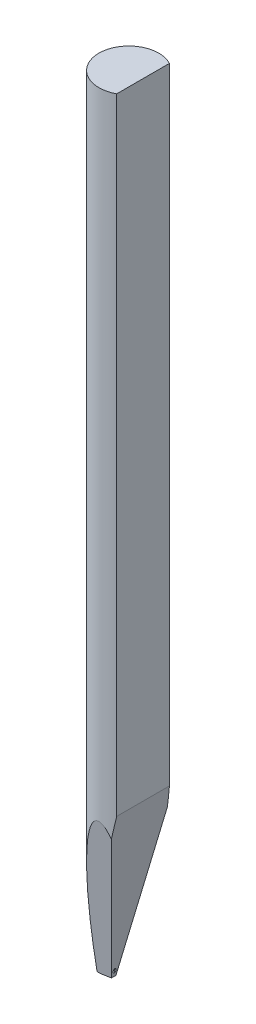
ISO-10303-21;
HEADER;
FILE_DESCRIPTION(('STEP AP214'),'2;1');
FILE_NAME('part.step','',(''),(''),'','','');
FILE_SCHEMA(('AUTOMOTIVE_DESIGN { 1 0 10303 214 1 1 1 1 }'));
ENDSEC;
DATA;
#1=APPLICATION_CONTEXT('core data for automotive mechanical design processes');
#2=APPLICATION_PROTOCOL_DEFINITION('international standard','automotive_design',2000,#1);
#3=PRODUCT_CONTEXT('',#1,'mechanical');
#4=PRODUCT('Part','Part','',(#3));
#5=PRODUCT_RELATED_PRODUCT_CATEGORY('part','',(#4));
#6=PRODUCT_DEFINITION_FORMATION('','',#4);
#7=PRODUCT_DEFINITION_CONTEXT('part definition',#1,'design');
#8=PRODUCT_DEFINITION('design','',#6,#7);
#9=PRODUCT_DEFINITION_SHAPE('','',#8);
#10=(LENGTH_UNIT() NAMED_UNIT(*) SI_UNIT(.MILLI.,.METRE.));
#11=(NAMED_UNIT(*) PLANE_ANGLE_UNIT() SI_UNIT($,.RADIAN.));
#12=(NAMED_UNIT(*) SI_UNIT($,.STERADIAN.) SOLID_ANGLE_UNIT());
#13=UNCERTAINTY_MEASURE_WITH_UNIT(LENGTH_MEASURE(1.E-05),#10,'distance_accuracy_value','');
#14=(GEOMETRIC_REPRESENTATION_CONTEXT(3) GLOBAL_UNCERTAINTY_ASSIGNED_CONTEXT((#13)) GLOBAL_UNIT_ASSIGNED_CONTEXT((#10,
#11,#12)) REPRESENTATION_CONTEXT('',''));
#15=CARTESIAN_POINT('',(0.,0.,0.));
#16=DIRECTION('',(0.,0.,1.));
#17=DIRECTION('',(1.,0.,0.));
#18=AXIS2_PLACEMENT_3D('',#15,#16,#17);
#19=CARTESIAN_POINT('',(0.,21.0312,0.));
#20=DIRECTION('',(0.,-1.,0.));
#21=DIRECTION('',(0.,0.,-1.));
#22=AXIS2_PLACEMENT_3D('',#19,#20,#21);
#23=CYLINDRICAL_SURFACE('',#22,0.792479999999998);
#24=CARTESIAN_POINT('',(0.,0.02413,0.));
#25=DIRECTION('',(0.,-1.,0.));
#26=DIRECTION('',(0.,0.,-1.));
#27=AXIS2_PLACEMENT_3D('',#24,#25,#26);
#28=CIRCLE('',#27,0.79248);
#29=CARTESIAN_POINT('',(-0.790565318424321,0.02413,0.0550547700444953));
#30=VERTEX_POINT('',#29);
#31=CARTESIAN_POINT('',(-0.792479866152421,0.02413,-0.000460589882886893));
#32=VERTEX_POINT('',#31);
#33=EDGE_CURVE('E161',#30,#32,#28,.T.);
#34=ORIENTED_EDGE('',*,*,#33,.F.);
#35=CARTESIAN_POINT('',(0.,-0.288101116436578,0.));
#36=DIRECTION('',(0.,-0.173648177666931,0.984807753012208));
#37=DIRECTION('',(0.,-0.984807753012208,-0.173648177666931));
#38=AXIS2_PLACEMENT_3D('',#35,#36,#37);
#39=ELLIPSE('',#38,4.56371043248163,0.792479999999998);
#40=CARTESIAN_POINT('',(0.279336812010102,3.91781682663915,0.741616812010104));
#41=VERTEX_POINT('',#40);
#42=EDGE_CURVE('E173',#41,#30,#39,.T.);
#43=ORIENTED_EDGE('',*,*,#42,.F.);
#44=CARTESIAN_POINT('',(0.,2.33361904313629,0.));
#45=DIRECTION('',(-0.984807753012208,0.173648177666931,0.));
#46=DIRECTION('',(-0.173648177666931,-0.984807753012208,0.));
#47=AXIS2_PLACEMENT_3D('',#44,#45,#46);
#48=ELLIPSE('',#47,4.56371043248164,0.792479999999998);
#49=CARTESIAN_POINT('',(0.37592,4.46556730476697,0.69764511322018));
#50=VERTEX_POINT('',#49);
#51=EDGE_CURVE('E308',#41,#50,#48,.T.);
#52=ORIENTED_EDGE('',*,*,#51,.T.);
#53=DIRECTION('',(0.,-1.,0.));
#54=VECTOR('',#53,1.);
#55=CARTESIAN_POINT('',(0.37592,21.0312,0.69764511322018));
#56=LINE('',#55,#54);
#57=CARTESIAN_POINT('',(0.37592,21.0312,0.69764511322018));
#58=VERTEX_POINT('',#57);
#59=EDGE_CURVE('E319',#58,#50,#56,.T.);
#60=ORIENTED_EDGE('',*,*,#59,.F.);
#61=CARTESIAN_POINT('',(0.,21.0312,0.));
#62=DIRECTION('',(0.,1.,0.));
#63=DIRECTION('',(0.,0.,1.));
#64=AXIS2_PLACEMENT_3D('',#61,#62,#63);
#65=CIRCLE('',#64,0.792479999999998);
#66=CARTESIAN_POINT('',(0.37592,21.0312,-0.69764511322018));
#67=VERTEX_POINT('',#66);
#68=EDGE_CURVE('E314',#67,#58,#65,.T.);
#69=ORIENTED_EDGE('',*,*,#68,.F.);
#70=DIRECTION('',(0.,-1.,0.));
#71=VECTOR('',#70,1.);
#72=CARTESIAN_POINT('',(0.37592,21.0312,-0.69764511322018));
#73=LINE('',#72,#71);
#74=CARTESIAN_POINT('',(0.37592,4.46556730476697,-0.69764511322018));
#75=VERTEX_POINT('',#74);
#76=EDGE_CURVE('E302',#75,#67,#73,.F.);
#77=ORIENTED_EDGE('',*,*,#76,.F.);
#78=CARTESIAN_POINT('',(0.279336812010102,3.91781682663915,-0.741616812010104));
#79=VERTEX_POINT('',#78);
#80=EDGE_CURVE('E299',#75,#79,#48,.T.);
#81=ORIENTED_EDGE('',*,*,#80,.T.);
#82=CARTESIAN_POINT('',(0.,-0.288101116436578,0.));
#83=DIRECTION('',(0.,-0.173648177666931,-0.984807753012208));
#84=DIRECTION('',(0.,-0.984807753012208,0.173648177666931));
#85=AXIS2_PLACEMENT_3D('',#82,#83,#84);
#86=ELLIPSE('',#85,4.56371043248163,0.792479999999998);
#87=CARTESIAN_POINT('',(-0.790565318424321,0.02413,-0.0550547700444953));
#88=VERTEX_POINT('',#87);
#89=EDGE_CURVE('E54',#88,#79,#86,.T.);
#90=ORIENTED_EDGE('',*,*,#89,.F.);
#91=EDGE_CURVE('E176',#32,#88,#28,.T.);
#92=ORIENTED_EDGE('',*,*,#91,.F.);
#93=EDGE_LOOP('',(#34,#43,#52,#60,#69,#77,#81,#90,#92));
#94=FACE_BOUND('',#93,.T.);
#95=ADVANCED_FACE('F46',(#94),#23,.T.);
#96=CARTESIAN_POINT('',(26.8738719491216,0.,0.0508));
#97=DIRECTION('',(0.,-0.173648177666931,0.984807753012208));
#98=DIRECTION('',(0.,-0.984807753012208,-0.173648177666931));
#99=AXIS2_PLACEMENT_3D('',#96,#97,#98);
#100=PLANE('',#99);
#101=ORIENTED_EDGE('',*,*,#42,.T.);
#102=CARTESIAN_POINT('',(-0.790562030892619,0.02433,0.055090035440637));
#103=CARTESIAN_POINT('',(-0.790591130197224,0.0229716682347761,0.0548505249016747));
#104=CARTESIAN_POINT('',(-0.790502987341162,0.0216110092912109,0.0546106040183818));
#105=CARTESIAN_POINT('',(-0.790098037345441,0.0189231522553185,0.0541366623026669));
#106=CARTESIAN_POINT('',(-0.789781238751954,0.0175959529143336,0.0539026412500728));
#107=CARTESIAN_POINT('',(-0.78892444074666,0.0150119437472768,0.0534470107155227));
#108=CARTESIAN_POINT('',(-0.788384255019471,0.013755193675145,0.0532254117697985));
#109=CARTESIAN_POINT('',(-0.787094991195339,0.0113508771416751,0.0528014658947843));
#110=CARTESIAN_POINT('',(-0.78634600293641,0.0102032640079511,0.0525991107358934));
#111=CARTESIAN_POINT('',(-0.78466939826834,0.00806424805332879,0.0522219445109276));
#112=CARTESIAN_POINT('',(-0.783744018066812,0.00707114591225422,0.0520468338088568));
#113=CARTESIAN_POINT('',(-0.781734639197898,0.00525473219688734,0.0517265510627087));
#114=CARTESIAN_POINT('',(-0.780650623292242,0.00443143909848094,0.0515813822764286));
#115=CARTESIAN_POINT('',(-0.778372499616051,0.00299079932300508,0.0513273586145304));
#116=CARTESIAN_POINT('',(-0.777180271998541,0.00237056794238561,0.0512179950878451));
#117=CARTESIAN_POINT('',(-0.774706570215517,0.00133774552098709,0.0510358806286719));
#118=CARTESIAN_POINT('',(-0.77342510748044,0.000925127941726119,0.0509631250167336));
#119=CARTESIAN_POINT('',(-0.770819076608367,0.000321291054966231,0.0508566522816508));
#120=CARTESIAN_POINT('',(-0.769494875405856,0.000128533690737077,0.050822663957607));
#121=CARTESIAN_POINT('',(-0.766832408333603,-3.61808735663629E-05,0.0507936203358046));
#122=CARTESIAN_POINT('',(-0.765494142057223,-8.13167220641328E-06,0.0507985661667917));
#123=CARTESIAN_POINT('',(-0.762835759657935,0.00026718993201182,0.0508471127939873));
#124=CARTESIAN_POINT('',(-0.761515736751644,0.000515332728070437,0.0508908670640009));
#125=CARTESIAN_POINT('',(-0.758935670841567,0.00122337607735281,0.0510157142099906));
#126=CARTESIAN_POINT('',(-0.757675631161833,0.00168328835103095,0.051096809152599));
#127=CARTESIAN_POINT('',(-0.755232691044058,0.00280813198321104,0.0512951494340305));
#128=CARTESIAN_POINT('',(-0.7540510824246,0.00347578322134789,0.0514128743610174));
#129=CARTESIAN_POINT('',(-0.751815823874314,0.00499369189982735,0.0516805226152849));
#130=CARTESIAN_POINT('',(-0.750762180687165,0.00584395895734972,0.0518304476383337));
#131=CARTESIAN_POINT('',(-0.748793019018963,0.00771914525337735,0.0521610935761781));
#132=CARTESIAN_POINT('',(-0.747880267982819,0.00874688330644843,0.0523423115240353));
#133=CARTESIAN_POINT('',(-0.746239697073483,0.0109371843161988,0.0527285206879273));
#134=CARTESIAN_POINT('',(-0.745511943653139,0.0120997955027694,0.0529335204081932));
#135=CARTESIAN_POINT('',(-0.744251796134267,0.0145451018720345,0.0533646938971929));
#136=CARTESIAN_POINT('',(-0.743722429063375,0.0158293102622683,0.0535911344852433));
#137=CARTESIAN_POINT('',(-0.742890044599474,0.0184653571145927,0.0540559406677197));
#138=CARTESIAN_POINT('',(-0.74258672897938,0.0198171039512355,0.0542942901061072));
#139=CARTESIAN_POINT('',(-0.74225786477379,0.0222267353646096,0.0547191731378477));
#140=CARTESIAN_POINT('',(-0.742183527393376,0.0232783521171363,0.0549046015446832));
#141=CARTESIAN_POINT('',(-0.742179041809478,0.0243300000000075,0.0550900354406383));
#142=B_SPLINE_CURVE_WITH_KNOTS('',3,(#102,#103,#104,#105,#106,#107,#108,#109,#110,#111,#112,
#113,#114,#115,#116,#117,#118,#119,#120,#121,#122,#123,#124,#125,#126,#127,#128,#129,#130,#131,
#132,#133,#134,#135,#136,#137,#138,#139,#140,#141),.UNSPECIFIED.,.F.,.F.,(4,2,2,2,2,2,2,2,2,2,2,
2,2,2,2,2,2,2,2,4),(0.,0.00413390242035442,0.00826765034116315,0.0124048529782261,
0.0165402783094799,0.0206263980261588,0.0247129620943396,0.0287386615603367,0.0327638463056829,
0.0367606963104585,0.0407576621889021,0.044770505497248,0.0487835709244832,0.052851561939712,
0.0569197672419519,0.0610598067711752,0.0652013313459459,0.0694036978373802,0.0736005103326074,
0.0768028366478287),.UNSPECIFIED.);
#143=CARTESIAN_POINT('',(-0.7666693476209,0.,0.0507920655077495));
#144=VERTEX_POINT('',#143);
#145=EDGE_CURVE('E158',#30,#144,#142,.T.);
#146=ORIENTED_EDGE('',*,*,#145,.T.);
#147=CARTESIAN_POINT('',(-0.695960000000006,0.,0.0507841225187557));
#148=DIRECTION('',(-1.,0.,0.));
#149=VECTOR('',#148,1.);
#150=LINE('',#147,#149);
#151=CARTESIAN_POINT('',(-0.695960000000002,0.,0.0507920612593779));
#152=VERTEX_POINT('',#151);
#153=EDGE_CURVE('E185',#152,#144,#150,.T.);
#154=ORIENTED_EDGE('',*,*,#153,.F.);
#155=DIRECTION('',(-0.984346441568213,-0.173566836012845,-0.0306045161452665));
#156=VECTOR('',#155,1.);
#157=CARTESIAN_POINT('',(26.017495541594,4.71030295993911,0.881353499148213));
#158=LINE('',#157,#156);
#159=CARTESIAN_POINT('',(-0.402351353643026,0.0517711261220242,0.0599286463569739));
#160=VERTEX_POINT('',#159);
#161=EDGE_CURVE('E346',#160,#152,#158,.T.);
#162=ORIENTED_EDGE('',*,*,#161,.F.);
#163=DIRECTION('',(-0.171087869746036,-0.970287525247814,-0.171087869746036));
#164=VECTOR('',#163,1.);
#165=CARTESIAN_POINT('',(0.387191151492609,4.52948918131316,0.849471151492611));
#166=LINE('',#165,#164);
#167=EDGE_CURVE('E180',#41,#160,#166,.T.);
#168=ORIENTED_EDGE('',*,*,#167,.F.);
#169=EDGE_LOOP('',(#101,#146,#154,#162,#168));
#170=FACE_BOUND('',#169,.T.);
#171=ADVANCED_FACE('F178',(#170),#100,.T.);
#172=CARTESIAN_POINT('',(26.8738719491216,0.,-0.0508));
#173=DIRECTION('',(0.,-0.173648177666931,-0.984807753012208));
#174=DIRECTION('',(0.,0.984807753012208,-0.173648177666931));
#175=AXIS2_PLACEMENT_3D('',#172,#173,#174);
#176=PLANE('',#175);
#177=CARTESIAN_POINT('',(-0.695959999999999,0.,-0.0508000000000001));
#178=DIRECTION('',(-1.,0.,0.));
#179=VECTOR('',#178,1.);
#180=LINE('',#177,#179);
#181=CARTESIAN_POINT('',(-0.695960000000002,0.,-0.0507920612593779));
#182=VERTEX_POINT('',#181);
#183=CARTESIAN_POINT('',(-0.766887730565651,0.,-0.0507920612593779));
#184=VERTEX_POINT('',#183);
#185=EDGE_CURVE('E181',#182,#184,#180,.T.);
#186=ORIENTED_EDGE('',*,*,#185,.T.);
#187=CARTESIAN_POINT('',(-0.742179041809478,0.0243300000000076,-0.0550900354406383));
#188=CARTESIAN_POINT('',(-0.742184604135078,0.0229458350404107,-0.0548459698125101));
#189=CARTESIAN_POINT('',(-0.742311508970783,0.0215627401650111,-0.0546020928690976));
#190=CARTESIAN_POINT('',(-0.742798300794755,0.0188378199026354,-0.0541216159065616));
#191=CARTESIAN_POINT('',(-0.74315802579363,0.0174959665005064,-0.0538850109476108));
#192=CARTESIAN_POINT('',(-0.74410093172325,0.0148902350948695,-0.0534255501963176));
#193=CARTESIAN_POINT('',(-0.744684180083338,0.013626380754712,-0.0532026985764623));
#194=CARTESIAN_POINT('',(-0.746057419063688,0.0112129818373202,-0.0527771512321135));
#195=CARTESIAN_POINT('',(-0.74684737839829,0.0100634199982429,-0.0525744524638914));
#196=CARTESIAN_POINT('',(-0.748613528904207,0.00791042373658049,-0.0521948211335958));
#197=CARTESIAN_POINT('',(-0.749589921061213,0.00690714909802567,-0.0520179167457581));
#198=CARTESIAN_POINT('',(-0.751701582892008,0.00507812421606544,-0.0516954103106814));
#199=CARTESIAN_POINT('',(-0.752836866805378,0.00425238990033082,-0.0515498110719205));
#200=CARTESIAN_POINT('',(-0.755221838424719,0.00281191231249112,-0.0512958160080785));
#201=CARTESIAN_POINT('',(-0.756470221114728,0.00219507469079761,-0.0511870508926579));
#202=CARTESIAN_POINT('',(-0.759055675894313,0.00118073995618023,-0.0510081963114751));
#203=CARTESIAN_POINT('',(-0.760392734557678,0.000783209723007456,-0.0509381010057194));
#204=CARTESIAN_POINT('',(-0.763092711791989,0.000226157139190678,-0.0508398776055192));
#205=CARTESIAN_POINT('',(-0.76445477361924,6.26076997739812E-05,-0.0508110394266703));
#206=CARTESIAN_POINT('',(-0.767187277207153,-3.29541307433177E-05,-0.0507941892976242));
#207=CARTESIAN_POINT('',(-0.768557718288063,3.50149389997139E-05,-0.0508061740784735));
#208=CARTESIAN_POINT('',(-0.771244311848206,0.000398666897996158,-0.0508702957304321));
#209=CARTESIAN_POINT('',(-0.772560984858839,0.000690626196253426,-0.0509217760319835));
#210=CARTESIAN_POINT('',(-0.775125082119401,0.00148989015111099,-0.0510627078319327));
#211=CARTESIAN_POINT('',(-0.776372510615765,0.00199718158588093,-0.0511521569989649));
#212=CARTESIAN_POINT('',(-0.778752699896453,0.0032075171166551,-0.0513655718087505));
#213=CARTESIAN_POINT('',(-0.779886288213959,0.00390898415738682,-0.0514892593741092));
#214=CARTESIAN_POINT('',(-0.782018187365782,0.00548879591026707,-0.0517678228105824));
#215=CARTESIAN_POINT('',(-0.783016503586736,0.00636713357582832,-0.0519226974391933));
#216=CARTESIAN_POINT('',(-0.784853641208268,0.00827814175492947,-0.0522596597415234));
#217=CARTESIAN_POINT('',(-0.785691948520383,0.00931129129366988,-0.0524418318803098));
#218=CARTESIAN_POINT('',(-0.78718328744559,0.0115003977901972,-0.0528278304192918));
#219=CARTESIAN_POINT('',(-0.787836257989602,0.0126563950546721,-0.0530316639266439));
#220=CARTESIAN_POINT('',(-0.788947528169182,0.0150739454800639,-0.0534579432938637));
#221=CARTESIAN_POINT('',(-0.789403179275597,0.0163366781618654,-0.0536805971350877));
#222=CARTESIAN_POINT('',(-0.790095791275579,0.0189174377856174,-0.0541356546874782));
#223=CARTESIAN_POINT('',(-0.79033302701083,0.0202353930479441,-0.0543680457595931));
#224=CARTESIAN_POINT('',(-0.790547042656138,0.0224827807287369,-0.0547643208438287));
#225=CARTESIAN_POINT('',(-0.790581450551353,0.0234071736021358,-0.0549273162481835));
#226=CARTESIAN_POINT('',(-0.790562030892619,0.02433,-0.055090035440637));
#227=B_SPLINE_CURVE_WITH_KNOTS('',3,(#187,#188,#189,#190,#191,#192,#193,#194,#195,#196,#197,
#198,#199,#200,#201,#202,#203,#204,#205,#206,#207,#208,#209,#210,#211,#212,#213,#214,#215,#216,
#217,#218,#219,#220,#221,#222,#223,#224,#225,#226),.UNSPECIFIED.,.F.,.F.,(4,2,2,2,2,2,2,2,2,2,2,
2,2,2,2,2,2,2,2,4),(0.,0.0042107250124542,0.00841852347173037,0.0126275922801133,
0.0168360244149653,0.0210490193712216,0.0252623921302361,0.0294321771890222,0.0336013323458577,
0.0376978306041177,0.0417940008374756,0.0458235140020191,0.0498527797820559,0.0538502351412016,
0.057847531271832,0.0618574616558775,0.0658687117954643,0.0699322494680731,0.073990666795414,
0.0768021851502806),.UNSPECIFIED.);
#228=EDGE_CURVE('E168',#184,#88,#227,.T.);
#229=ORIENTED_EDGE('',*,*,#228,.T.);
#230=ORIENTED_EDGE('',*,*,#89,.T.);
#231=DIRECTION('',(0.171087869746036,0.970287525247814,-0.171087869746036));
#232=VECTOR('',#231,1.);
#233=CARTESIAN_POINT('',(0.387191151492609,4.52948918131316,-0.849471151492611));
#234=LINE('',#233,#232);
#235=CARTESIAN_POINT('',(-0.402351353643026,0.0517711261220242,-0.0599286463569739));
#236=VERTEX_POINT('',#235);
#237=EDGE_CURVE('E310',#236,#79,#234,.T.);
#238=ORIENTED_EDGE('',*,*,#237,.F.);
#239=DIRECTION('',(0.984346441568213,0.173566836012845,-0.0306045161452665));
#240=VECTOR('',#239,1.);
#241=CARTESIAN_POINT('',(26.017495541594,4.71030295993911,-0.881353499148213));
#242=LINE('',#241,#240);
#243=EDGE_CURVE('E313',#182,#236,#242,.T.);
#244=ORIENTED_EDGE('',*,*,#243,.F.);
#245=EDGE_LOOP('',(#186,#229,#230,#238,#244));
#246=FACE_BOUND('',#245,.T.);
#247=ADVANCED_FACE('F232',(#246),#176,.T.);
#248=CARTESIAN_POINT('',(27.2739219491216,-0.33655,0.));
#249=DIRECTION('',(-1.,0.,0.));
#250=DIRECTION('',(0.,0.,1.));
#251=AXIS2_PLACEMENT_3D('',#248,#249,#250);
#252=CYLINDRICAL_SURFACE('',#251,0.34036);
#253=CARTESIAN_POINT('',(-0.772948732447915,0.000743038003496626,-0.0455887319632913));
#254=CARTESIAN_POINT('',(-0.774244052011,0.00103769435949966,-0.0434077682315424));
#255=CARTESIAN_POINT('',(-0.775224602739792,0.00133436726837024,-0.041045667743512));
#256=CARTESIAN_POINT('',(-0.776890803829398,0.00188727097236075,-0.0362121093467644));
#257=CARTESIAN_POINT('',(-0.7775737422189,0.00214311691482537,-0.0337398631735708));
#258=CARTESIAN_POINT('',(-0.779812108405624,0.00302371478641382,-0.0241755835916287));
#259=CARTESIAN_POINT('',(-0.780678806650201,0.00346735761602362,-0.016903998667426));
#260=CARTESIAN_POINT('',(-0.781500520296575,0.00388075769635122,-0.00233344658422308));
#261=CARTESIAN_POINT('',(-0.781456784046158,0.00385116384133585,0.00496546936265765));
#262=CARTESIAN_POINT('',(-0.780644955446454,0.00345787442285158,0.0159136597539844));
#263=CARTESIAN_POINT('',(-0.780242988222936,0.00326532054040031,0.0195956343719516));
#264=CARTESIAN_POINT('',(-0.77912346117235,0.00276482479812617,0.0269012955115707));
#265=CARTESIAN_POINT('',(-0.778406582971011,0.00245713236796989,0.0305250904990221));
#266=CARTESIAN_POINT('',(-0.776968500841152,0.0019206697906541,0.0358575804806945));
#267=CARTESIAN_POINT('',(-0.776428228639165,0.00172921868022678,0.0376189437520815));
#268=CARTESIAN_POINT('',(-0.77517457291461,0.00132570538406236,0.0410845312961742));
#269=CARTESIAN_POINT('',(-0.774461031775306,0.00111362453806423,0.0427887019269864));
#270=CARTESIAN_POINT('',(-0.773170013413911,0.000791474460085587,0.0452366898759041));
#271=CARTESIAN_POINT('',(-0.772700748366475,0.000683012576990634,0.0460373882015157));
#272=CARTESIAN_POINT('',(-0.771654205871831,0.000470646071660774,0.0475666843472414));
#273=CARTESIAN_POINT('',(-0.771077514633462,0.000366720325707391,0.0482956421245056));
#274=CARTESIAN_POINT('',(-0.770141774394259,0.000234040944416114,0.0492089072612849));
#275=CARTESIAN_POINT('',(-0.769852715676239,0.00019687282302303,0.0494623993428604));
#276=CARTESIAN_POINT('',(-0.769239237657397,0.000128842579186035,0.0499233352697982));
#277=CARTESIAN_POINT('',(-0.768914947378604,9.79585632287877E-05,0.050130939213283));
#278=CARTESIAN_POINT('',(-0.768366083833755,5.68749300598059E-05,0.0504058790983308));
#279=CARTESIAN_POINT('',(-0.768153362679429,4.33392995133567E-05,0.0504961293220678));
#280=CARTESIAN_POINT('',(-0.767716252815511,2.12552807333059E-05,0.0506431162934807));
#281=CARTESIAN_POINT('',(-0.767491875887946,1.27019590986029E-05,0.0506998861935237));
#282=CARTESIAN_POINT('',(-0.7670339093008,1.65683510916269E-06,0.0507731565218476));
#283=CARTESIAN_POINT('',(-0.766800250268781,-7.73913735548352E-07,0.050789251348772));
#284=CARTESIAN_POINT('',(-0.766334261482551,1.2092218747426E-06,0.0507761088778736));
#285=CARTESIAN_POINT('',(-0.76610193111533,5.61964218922558E-06,0.0507468945231145));
#286=CARTESIAN_POINT('',(-0.765674443147952,1.99555736495871E-05,0.0506517173017769));
#287=CARTESIAN_POINT('',(-0.765478156067328,2.91608703905449E-05,0.0505905509492955));
#288=CARTESIAN_POINT('',(-0.765097140736894,5.17810441061114E-05,0.0504398298435602));
#289=CARTESIAN_POINT('',(-0.764912420443402,6.51987813087116E-05,0.0503502558011914));
#290=CARTESIAN_POINT('',(-0.764453350809653,0.000104045439721441,0.0500900066937025));
#291=CARTESIAN_POINT('',(-0.76418888383395,0.000131934855512037,0.0499023761206642));
#292=CARTESIAN_POINT('',(-0.76369193382301,0.000192879184651362,0.0494894657940851));
#293=CARTESIAN_POINT('',(-0.763459552109705,0.000225949788106176,0.0492640715325618));
#294=CARTESIAN_POINT('',(-0.762822977360724,0.000326550597653473,0.0485728919492247));
#295=CARTESIAN_POINT('',(-0.762454817045988,0.000398058835490681,0.0480749630510034));
#296=CARTESIAN_POINT('',(-0.761788113552521,0.000544726314346101,0.0470357211276947));
#297=CARTESIAN_POINT('',(-0.761489789569495,0.00061989617934512,0.0464942784840302));
#298=CARTESIAN_POINT('',(-0.760283242207767,0.000949968171522591,0.0440705383709133));
#299=CARTESIAN_POINT('',(-0.75961842302177,0.00120571102644731,0.0420717997970306));
#300=CARTESIAN_POINT('',(-0.758513193732638,0.00168719156113817,0.038011381729477));
#301=CARTESIAN_POINT('',(-0.758074367603987,0.00191270946936327,0.035949362513667));
#302=CARTESIAN_POINT('',(-0.756909140621584,0.00256290814948425,0.0294448965969568));
#303=CARTESIAN_POINT('',(-0.756420088990584,0.00292380951479635,0.0249519471083365));
#304=CARTESIAN_POINT('',(-0.75572681322034,0.00346731140341717,0.0159324800299341));
#305=CARTESIAN_POINT('',(-0.755523399563459,0.00364940412900276,0.011405903411767));
#306=CARTESIAN_POINT('',(-0.755195420535111,0.0039230959077535,-0.00219818198388527));
#307=CARTESIAN_POINT('',(-0.755353227189989,0.0037420055050044,-0.0112990256858496));
#308=CARTESIAN_POINT('',(-0.756346090185568,0.00298886896378123,-0.0239012198473096));
#309=CARTESIAN_POINT('',(-0.756714509509232,0.00271903025577616,-0.027464482259343));
#310=CARTESIAN_POINT('',(-0.757752052852076,0.00207287252681067,-0.0345217289154075));
#311=CARTESIAN_POINT('',(-0.758418714183111,0.00169743471555229,-0.0380160406324429));
#312=CARTESIAN_POINT('',(-0.759878165609434,0.0011160454674125,-0.0427604064469739));
#313=CARTESIAN_POINT('',(-0.760356389840989,0.000943223388390901,-0.0441013946499471));
#314=CARTESIAN_POINT('',(-0.761251845619893,0.000682112328128259,-0.0460420527150664));
#315=CARTESIAN_POINT('',(-0.761582629787307,0.00059421237896128,-0.0466808633016311));
#316=CARTESIAN_POINT('',(-0.762331429042434,0.000422391343123347,-0.0479051990145601));
#317=CARTESIAN_POINT('',(-0.762748866084265,0.000338448198530641,-0.0484910420656047));
#318=CARTESIAN_POINT('',(-0.763410019126463,0.000233713531677358,-0.0492107696865635));
#319=CARTESIAN_POINT('',(-0.763596253306186,0.000206604599692633,-0.0493958521134998));
#320=CARTESIAN_POINT('',(-0.763989774251016,0.000155443211673836,-0.0497433861174004));
#321=CARTESIAN_POINT('',(-0.76419707652013,0.000131393036312275,-0.0499058208163353));
#322=CARTESIAN_POINT('',(-0.764637008157888,8.75700481232914E-05,-0.0502005843958868));
#323=CARTESIAN_POINT('',(-0.76486993314813,6.78572509603353E-05,-0.0503324920303911));
#324=CARTESIAN_POINT('',(-0.765356626817177,3.51586498656924E-05,-0.0505506967631714));
#325=CARTESIAN_POINT('',(-0.765610338136953,2.21550116380786E-05,-0.0506371147945011));
#326=CARTESIAN_POINT('',(-0.766108804916348,5.34442169249798E-06,-0.0507487221607792));
#327=CARTESIAN_POINT('',(-0.76635249398824,8.5081423103777E-07,-0.0507784841615761));
#328=CARTESIAN_POINT('',(-0.766840911423961,-6.29608770148479E-07,-0.0507882949897779));
#329=CARTESIAN_POINT('',(-0.767085640204016,2.38693534970298E-06,-0.0507683215680855));
#330=CARTESIAN_POINT('',(-0.767573471852292,1.53605772798063E-05,-0.0506822396900822));
#331=CARTESIAN_POINT('',(-0.7678163297708,2.55129569116145E-05,-0.050614833099111));
#332=CARTESIAN_POINT('',(-0.768287725682985,5.14603121441733E-05,-0.0504419878495284));
#333=CARTESIAN_POINT('',(-0.768516237731677,6.72651834378381E-05,-0.0503364824890803));
#334=CARTESIAN_POINT('',(-0.769086367607395,0.00011346494584085,-0.0500267646603161));
#335=CARTESIAN_POINT('',(-0.769415820407645,0.000146982897116946,-0.0498009358985752));
#336=CARTESIAN_POINT('',(-0.770037926081348,0.000220032498524384,-0.0493045512562758));
#337=CARTESIAN_POINT('',(-0.770330476019338,0.000259580318707492,-0.049033874935413));
#338=CARTESIAN_POINT('',(-0.771066362106424,0.000368969403386985,-0.0482779577393314));
#339=CARTESIAN_POINT('',(-0.771483522594356,0.00044173860586339,-0.0477679608502451));
#340=CARTESIAN_POINT('',(-0.772257093719492,0.000590637805822947,-0.0467056200324401));
#341=CARTESIAN_POINT('',(-0.772613457215486,0.000666770354137416,-0.0461532437200188));
#342=CARTESIAN_POINT('',(-0.772948732447915,0.000743038003496626,-0.0455887319632913));
#343=B_SPLINE_CURVE_WITH_KNOTS('',3,(#253,#254,#255,#256,#257,#258,#259,#260,#261,#262,#263,
#264,#265,#266,#267,#268,#269,#270,#271,#272,#273,#274,#275,#276,#277,#278,#279,#280,#281,#282,
#283,#284,#285,#286,#287,#288,#289,#290,#291,#292,#293,#294,#295,#296,#297,#298,#299,#300,#301,
#302,#303,#304,#305,#306,#307,#308,#309,#310,#311,#312,#313,#314,#315,#316,#317,#318,#319,#320,
#321,#322,#323,#324,#325,#326,#327,#328,#329,#330,#331,#332,#333,#334,#335,#336,#337,#338,#339,
#340,#341,#342),.UNSPECIFIED.,.T.,.F.,(4,2,2,2,2,2,2,2,2,2,2,2,2,2,2,2,2,2,2,2,2,2,2,2,2,2,2,2,
2,2,2,2,2,2,2,2,2,2,2,2,2,2,2,2,4),(0.,0.00766052067924042,0.0153894575837347,
0.0372542358342682,0.059089036038551,0.0702051603599432,0.0812973414517127,0.086850367921107,
0.0924084648345295,0.0952082167140209,0.0979931159960058,0.0991491366123841,0.10030105801843,
0.100993276886602,0.101684809160645,0.102383210483572,0.103081258274729,0.103696082876648,
0.104311325847875,0.105282059353728,0.106255791455911,0.108115409287161,0.109980787913421,
0.116297571745211,0.122658046841619,0.136223636222871,0.149827639985548,0.17703873072466,
0.187814077655302,0.198502045610053,0.202790047800471,0.204961092067916,0.207118094070229,
0.207908590804031,0.208699673535572,0.20950109606789,0.210300377137334,0.211031846425585,
0.211763642994758,0.212516287790387,0.213270256727002,0.214465929056578,0.215664866076041,
0.217646154651747,0.219628972579038),.UNSPECIFIED.);
#344=CARTESIAN_POINT('',(-0.779022295187443,0.00272886608585445,0.027198475899007));
#345=VERTEX_POINT('',#344);
#346=EDGE_CURVE('E163',#345,#144,#343,.T.);
#347=ORIENTED_EDGE('',*,*,#346,.F.);
#348=CARTESIAN_POINT('',(-0.790851138521022,0.,-0.0507841225187557));
#349=CARTESIAN_POINT('',(-0.781672847989257,0.00265885189672187,-0.0331637214670044));
#350=CARTESIAN_POINT('',(-0.772159999999997,0.00380999999999996,-0.0165186674285798));
#351=CARTESIAN_POINT('',(-0.772159999999997,0.00380999999999998,0.0165186674285799));
#352=CARTESIAN_POINT('',(-0.781672847989255,0.00265885189672172,0.0331637214670053));
#353=CARTESIAN_POINT('',(-0.790851138521022,0.,0.0507841225187556));
#354=(BOUNDED_CURVE() B_SPLINE_CURVE(3,(#348,#349,#350,#351,#352,#353),.UNSPECIFIED.,.F.,
.F.) B_SPLINE_CURVE_WITH_KNOTS((4,2,4),(0.,5.07841225187557E-05,0.000101568245037511),
.UNSPECIFIED.) CURVE() GEOMETRIC_REPRESENTATION_ITEM() RATIONAL_B_SPLINE_CURVE((1.,1.,1.,1.,1.,1.)) REPRESENTATION_ITEM(''));
#355=CARTESIAN_POINT('',(-0.779022324608316,0.00272885632660662,-0.0271985976569348));
#356=VERTEX_POINT('',#355);
#357=EDGE_CURVE('E434',#345,#356,#354,.F.);
#358=ORIENTED_EDGE('',*,*,#357,.T.);
#359=EDGE_CURVE('E68',#184,#356,#343,.T.);
#360=ORIENTED_EDGE('',*,*,#359,.F.);
#361=ORIENTED_EDGE('',*,*,#185,.F.);
#362=CARTESIAN_POINT('',(-2.60462989639233,-0.33655,0.));
#363=DIRECTION('',(-0.173648177666931,0.984807753012208,0.));
#364=DIRECTION('',(-0.984807753012208,-0.173648177666931,0.));
#365=AXIS2_PLACEMENT_3D('',#362,#363,#364);
#366=ELLIPSE('',#365,1.96005512164276,0.34036);
#367=CARTESIAN_POINT('',(-0.681167206717202,0.00260836857580135,-0.0285749999999997));
#368=VERTEX_POINT('',#367);
#369=EDGE_CURVE('E76',#368,#182,#366,.T.);
#370=ORIENTED_EDGE('',*,*,#369,.F.);
#371=DIRECTION('',(-1.,0.,0.));
#372=VECTOR('',#371,1.);
#373=CARTESIAN_POINT('',(27.2739219491216,0.00260836857580261,-0.028575));
#374=LINE('',#373,#372);
#375=CARTESIAN_POINT('',(-0.686858489816426,0.00260836857580266,-0.028575));
#376=VERTEX_POINT('',#375);
#377=EDGE_CURVE('E333',#376,#368,#374,.F.);
#378=ORIENTED_EDGE('',*,*,#377,.F.);
#379=CARTESIAN_POINT('',(-0.686858489816427,0.00260836857580261,0.028575));
#380=CARTESIAN_POINT('',(-0.694882558634214,0.00221755981884585,0.0332135322986734));
#381=CARTESIAN_POINT('',(-0.705716503578036,0.0022400805970264,0.033095862008332));
#382=CARTESIAN_POINT('',(-0.724043586112603,0.00311904698396639,0.0223381582503344));
#383=CARTESIAN_POINT('',(-0.730854835670747,0.00380563943309756,0.0115288461768743));
#384=CARTESIAN_POINT('',(-0.730928855863133,0.0038143113240413,-0.011269923025197));
#385=CARTESIAN_POINT('',(-0.724156392575137,0.00313056384671313,-0.0221747468136112));
#386=CARTESIAN_POINT('',(-0.705841797844351,0.00224694405597865,-0.033033854600958));
#387=CARTESIAN_POINT('',(-0.694919100214738,0.00221626932534476,-0.0332288492425225));
#388=CARTESIAN_POINT('',(-0.686858489816428,0.00260836857580261,-0.028575));
#389=(BOUNDED_CURVE() B_SPLINE_CURVE(3,(#379,#380,#381,#382,#383,#384,#385,#386,#387,#388),
.UNSPECIFIED.,.F.,.F.) B_SPLINE_CURVE_WITH_KNOTS((4,2,2,2,4),(0.,2.38139585135655E-05,
4.7627917027131E-05,7.14418755406965E-05,9.5255834054262E-05),
.UNSPECIFIED.) CURVE() GEOMETRIC_REPRESENTATION_ITEM() RATIONAL_B_SPLINE_CURVE((1.,1.,1.,1.,1.,
1.,1.,1.,1.,1.)) REPRESENTATION_ITEM(''));
#390=CARTESIAN_POINT('',(-0.686858489816427,0.0026083685758018,0.028575));
#391=VERTEX_POINT('',#390);
#392=EDGE_CURVE('E436',#376,#391,#389,.F.);
#393=ORIENTED_EDGE('',*,*,#392,.T.);
#394=DIRECTION('',(-1.,0.,0.));
#395=VECTOR('',#394,1.);
#396=CARTESIAN_POINT('',(27.2739219491216,0.00260836857580261,0.028575));
#397=LINE('',#396,#395);
#398=CARTESIAN_POINT('',(-0.681167206717202,0.00260836857580135,0.0285749999999997));
#399=VERTEX_POINT('',#398);
#400=EDGE_CURVE('E202',#391,#399,#397,.F.);
#401=ORIENTED_EDGE('',*,*,#400,.T.);
#402=EDGE_CURVE('E350',#152,#399,#366,.T.);
#403=ORIENTED_EDGE('',*,*,#402,.F.);
#404=ORIENTED_EDGE('',*,*,#153,.T.);
#405=EDGE_LOOP('',(#347,#358,#360,#361,#370,#378,#393,#401,#403,#404));
#406=FACE_BOUND('',#405,.T.);
#407=ADVANCED_FACE('F256',(#406),#252,.F.);
#408=CARTESIAN_POINT('',(-0.790851138521022,0.,-0.0507841225187557));
#409=CARTESIAN_POINT('',(-0.791832373230439,0.0125989339100697,-0.0355035476341192));
#410=CARTESIAN_POINT('',(-0.792479999999998,0.0241300000000007,-0.0179646526796647));
#411=CARTESIAN_POINT('',(-0.792479999999998,0.0241300000000007,0.017964652679665));
#412=CARTESIAN_POINT('',(-0.791832373230439,0.0125989339100728,0.0355035476341237));
#413=CARTESIAN_POINT('',(-0.790851138521022,0.,0.0507841225187556));
#414=CARTESIAN_POINT('',(-0.790851138521022,0.,-0.0507841225187557));
#415=CARTESIAN_POINT('',(-0.79193261126447,0.00254129614606856,-0.033942559517898));
#416=CARTESIAN_POINT('',(-0.792479999999999,0.00380999999999921,-0.0169790313800419));
#417=CARTESIAN_POINT('',(-0.792479999999999,0.00380999999999921,0.0169790313800421));
#418=CARTESIAN_POINT('',(-0.791932611264467,0.00254129614606956,0.0339425595178998));
#419=CARTESIAN_POINT('',(-0.790851138521022,0.,0.0507841225187556));
#420=CARTESIAN_POINT('',(-0.790851138521022,0.,-0.0507841225187557));
#421=CARTESIAN_POINT('',(-0.781672847989257,0.00265885189672187,-0.0331637214670044));
#422=CARTESIAN_POINT('',(-0.772159999999997,0.00380999999999996,-0.0165186674285798));
#423=CARTESIAN_POINT('',(-0.772159999999997,0.00380999999999998,0.0165186674285799));
#424=CARTESIAN_POINT('',(-0.781672847989255,0.00265885189672172,0.0331637214670053));
#425=CARTESIAN_POINT('',(-0.790851138521022,0.,0.0507841225187556));
#426=(BOUNDED_SURFACE() B_SPLINE_SURFACE(2,3,((#408,#409,#410,#411,#412,#413),(#414,#415,#416,
#417,#418,#419),(#420,#421,#422,#423,#424,#425)),.UNSPECIFIED.,.F.,.F.,
.F.) B_SPLINE_SURFACE_WITH_KNOTS((3,3),(4,2,4),(0.,1.),(0.,5.07841225187557E-05,
0.000101568245037511),
.UNSPECIFIED.) GEOMETRIC_REPRESENTATION_ITEM() RATIONAL_B_SPLINE_SURFACE(((1.,1.,1.,1.,1.,1.),
(0.703718137053402,0.705925465674569,0.70710678118652,0.707106781186524,0.70592546567461,
0.703718137053402),(1.,1.,1.,1.,1.,1.))) REPRESENTATION_ITEM('') SURFACE());
#427=CARTESIAN_POINT('',(-0.779023602444762,0.00272998884510614,0.0272149524723583));
#428=CARTESIAN_POINT('',(-0.779199442141796,0.00280583290733321,0.026266999002538));
#429=CARTESIAN_POINT('',(-0.779445857388198,0.00291845942652957,0.0253355199967759));
#430=CARTESIAN_POINT('',(-0.780056941163988,0.00322789832591545,0.0235360627644101));
#431=CARTESIAN_POINT('',(-0.780420577028759,0.00342398016266285,0.0226676083076848));
#432=CARTESIAN_POINT('',(-0.781659123230627,0.00415521322529103,0.0201797144288279));
#433=CARTESIAN_POINT('',(-0.782682177339524,0.00483347558973187,0.0186754343023283));
#434=CARTESIAN_POINT('',(-0.785500189244591,0.00715506684934407,0.0150460338509799));
#435=CARTESIAN_POINT('',(-0.787346441281359,0.00914104906599124,0.0131955630002845));
#436=CARTESIAN_POINT('',(-0.790254556528592,0.0137727817524092,0.00977547756115825));
#437=CARTESIAN_POINT('',(-0.791320241978632,0.0164152312285342,0.00820452330094105));
#438=CARTESIAN_POINT('',(-0.792088729395796,0.0198257750281829,0.00580369951793196));
#439=CARTESIAN_POINT('',(-0.792225940415498,0.0206554431747129,0.0051890784559129));
#440=CARTESIAN_POINT('',(-0.792380774293186,0.0219930381896872,0.00403163001337657));
#441=CARTESIAN_POINT('',(-0.792421901945094,0.0225229238451588,0.00352240042771776));
#442=CARTESIAN_POINT('',(-0.792472399805562,0.0234383885191073,0.00237034137617586));
#443=CARTESIAN_POINT('',(-0.792480889418724,0.0238197197564011,0.00172429731905992));
#444=CARTESIAN_POINT('',(-0.792479265637913,0.0240568522061703,0.000986849417424353));
#445=B_SPLINE_CURVE_WITH_KNOTS('',3,(#427,#428,#429,#430,#431,#432,#433,#434,#435,#436,#437,
#438,#439,#440,#441,#442,#443,#444),.UNSPECIFIED.,.F.,.F.,(4,2,2,2,2,2,2,2,4),(0.,
0.0028974367186199,0.00577001552976579,0.0115084282371355,0.0211539572471022,0.0307519328469377,
0.0338732606188023,0.0360600842467498,0.0383055119399857),.UNSPECIFIED.);
#446=EDGE_CURVE('E12',#345,#32,#445,.T.);
#447=CARTESIAN_POINT('',(-0.779023602460259,0.00272998884712115,-0.0272149525138275));
#448=CARTESIAN_POINT('',(-0.779199402077442,0.00280576407542985,-0.0262669742173918));
#449=CARTESIAN_POINT('',(-0.779445822930498,0.00291841840986194,-0.0253355575771444));
#450=CARTESIAN_POINT('',(-0.780056931560271,0.00322791674215935,-0.023536154755299));
#451=CARTESIAN_POINT('',(-0.780420595277152,0.00342403629455158,-0.0226676963260628));
#452=CARTESIAN_POINT('',(-0.781659056862825,0.00415508361176582,-0.0201795985327691));
#453=CARTESIAN_POINT('',(-0.782681846243115,0.00483282819535437,-0.018674856183621));
#454=CARTESIAN_POINT('',(-0.785407702767038,0.00707946952139112,-0.0151667494022276));
#455=CARTESIAN_POINT('',(-0.787154839741648,0.00893843719381465,-0.0133960511420077));
#456=CARTESIAN_POINT('',(-0.790075603473639,0.0133936693734061,-0.0100116041536168));
#457=CARTESIAN_POINT('',(-0.791205362910864,0.0160295105510695,-0.00841515605214681));
#458=CARTESIAN_POINT('',(-0.792114611275935,0.0198945012525077,-0.00577925868777283));
#459=CARTESIAN_POINT('',(-0.792293728025511,0.0211155369835148,-0.00490383761191616));
#460=CARTESIAN_POINT('',(-0.792455138426158,0.0228641297749814,-0.00313119292146868));
#461=CARTESIAN_POINT('',(-0.792482044801211,0.0234885969395252,-0.00233038332719305));
#462=CARTESIAN_POINT('',(-0.792478239499737,0.0239720398388283,-0.00140386714941404));
#463=B_SPLINE_CURVE_WITH_KNOTS('',3,(#447,#448,#449,#450,#451,#452,#453,#454,#455,#456,#457,
#458,#459,#460,#461,#462),.UNSPECIFIED.,.F.,.F.,(4,2,2,2,2,2,2,4),(0.,0.00289733310112432,
0.00577001551682486,0.0115084282091485,0.0206461826719079,0.0303688267050525,0.0348472182459107,
0.0378941095859264),.UNSPECIFIED.);
#464=EDGE_CURVE('E60',#32,#356,#463,.F.);
#465=ORIENTED_EDGE('',*,*,#357,.F.);
#466=ORIENTED_EDGE('',*,*,#446,.T.);
#467=ORIENTED_EDGE('',*,*,#464,.T.);
#468=EDGE_LOOP('',(#465,#466,#467));
#469=FACE_BOUND('',#468,.T.);
#470=ADVANCED_FACE('F49',(#469),#426,.T.);
#471=CARTESIAN_POINT('',(0.37592,21.0312,0.80247998));
#472=DIRECTION('',(1.,0.,0.));
#473=DIRECTION('',(0.,0.,-1.));
#474=AXIS2_PLACEMENT_3D('',#471,#472,#473);
#475=PLANE('',#474);
#476=DIRECTION('',(0.,0.,1.));
#477=VECTOR('',#476,1.);
#478=CARTESIAN_POINT('',(0.37592,4.46556730476697,0.80247998));
#479=LINE('',#478,#477);
#480=EDGE_CURVE('E305',#75,#50,#479,.T.);
#481=ORIENTED_EDGE('',*,*,#480,.F.);
#482=ORIENTED_EDGE('',*,*,#76,.T.);
#483=DIRECTION('',(0.,0.,1.));
#484=VECTOR('',#483,1.);
#485=CARTESIAN_POINT('',(0.37592,21.0312,0.80247998));
#486=LINE('',#485,#484);
#487=EDGE_CURVE('E183',#67,#58,#486,.T.);
#488=ORIENTED_EDGE('',*,*,#487,.T.);
#489=ORIENTED_EDGE('',*,*,#59,.T.);
#490=EDGE_LOOP('',(#481,#482,#488,#489));
#491=FACE_BOUND('',#490,.T.);
#492=ADVANCED_FACE('F358',(#491),#475,.T.);
#493=CARTESIAN_POINT('',(0.,21.0312,0.));
#494=DIRECTION('',(0.,1.,0.));
#495=DIRECTION('',(0.,0.,1.));
#496=AXIS2_PLACEMENT_3D('',#493,#494,#495);
#497=PLANE('',#496);
#498=ORIENTED_EDGE('',*,*,#68,.T.);
#499=ORIENTED_EDGE('',*,*,#487,.F.);
#500=EDGE_LOOP('',(#498,#499));
#501=FACE_BOUND('',#500,.T.);
#502=ADVANCED_FACE('F227',(#501),#497,.T.);
#503=CARTESIAN_POINT('',(-0.69596,0.,26.4674719491216));
#504=DIRECTION('',(-0.173648177666931,0.984807753012208,0.));
#505=DIRECTION('',(-0.984807753012208,-0.173648177666931,0.));
#506=AXIS2_PLACEMENT_3D('',#503,#504,#505);
#507=PLANE('',#506);
#508=ORIENTED_EDGE('',*,*,#161,.T.);
#509=ORIENTED_EDGE('',*,*,#402,.T.);
#510=DIRECTION('',(-0.984807753012208,-0.173648177666931,0.));
#511=VECTOR('',#510,1.);
#512=CARTESIAN_POINT('',(-0.69596,0.,0.0285749999999994));
#513=LINE('',#512,#511);
#514=CARTESIAN_POINT('',(-0.53086,0.0291115845149678,0.0285749999999997));
#515=VERTEX_POINT('',#514);
#516=EDGE_CURVE('E331',#515,#399,#513,.T.);
#517=ORIENTED_EDGE('',*,*,#516,.F.);
#518=DIRECTION('',(0.,0.,1.));
#519=VECTOR('',#518,1.);
#520=CARTESIAN_POINT('',(-0.53086,0.0291115845149677,26.4674719491216));
#521=LINE('',#520,#519);
#522=CARTESIAN_POINT('',(-0.53086,0.0291115845149678,-0.0285749999999997));
#523=VERTEX_POINT('',#522);
#524=EDGE_CURVE('E329',#523,#515,#521,.T.);
#525=ORIENTED_EDGE('',*,*,#524,.F.);
#526=DIRECTION('',(-0.984807753012208,-0.173648177666931,0.));
#527=VECTOR('',#526,1.);
#528=CARTESIAN_POINT('',(-0.69596,0.,-0.0285749999999994));
#529=LINE('',#528,#527);
#530=EDGE_CURVE('E316',#523,#368,#529,.T.);
#531=ORIENTED_EDGE('',*,*,#530,.T.);
#532=ORIENTED_EDGE('',*,*,#369,.T.);
#533=ORIENTED_EDGE('',*,*,#243,.T.);
#534=DIRECTION('',(0.,0.,-1.));
#535=VECTOR('',#534,1.);
#536=CARTESIAN_POINT('',(-0.402351353643026,0.0517711261220249,26.4674719491216));
#537=LINE('',#536,#535);
#538=EDGE_CURVE('E306',#160,#236,#537,.T.);
#539=ORIENTED_EDGE('',*,*,#538,.F.);
#540=EDGE_LOOP('',(#508,#509,#517,#525,#531,#532,#533,#539));
#541=FACE_BOUND('',#540,.T.);
#542=ADVANCED_FACE('F223',(#541),#507,.F.);
#543=CARTESIAN_POINT('',(-0.402351353643026,0.0517711261220249,26.4674719491216));
#544=DIRECTION('',(-0.984807753012208,0.173648177666931,0.));
#545=DIRECTION('',(-0.173648177666931,-0.984807753012208,0.));
#546=AXIS2_PLACEMENT_3D('',#543,#544,#545);
#547=PLANE('',#546);
#548=CARTESIAN_POINT('',(-0.376080567372774,0.200760158683566,0.));
#549=DIRECTION('',(-0.984807753012208,0.173648177666931,0.));
#550=DIRECTION('',(0.173648177666931,0.984807753012208,0.));
#551=AXIS2_PLACEMENT_3D('',#548,#549,#550);
#552=ELLIPSE('',#551,0.0566555398592855,0.04069486264531);
#553=CARTESIAN_POINT('',(-0.366242436121473,0.256554973588082,0.));
#554=VERTEX_POINT('',#553);
#555=EDGE_CURVE('E323',#554,#554,#552,.F.);
#556=ORIENTED_EDGE('',*,*,#555,.F.);
#557=EDGE_LOOP('',(#556));
#558=FACE_BOUND('',#557,.T.);
#559=ORIENTED_EDGE('',*,*,#51,.F.);
#560=ORIENTED_EDGE('',*,*,#167,.T.);
#561=ORIENTED_EDGE('',*,*,#538,.T.);
#562=ORIENTED_EDGE('',*,*,#237,.T.);
#563=ORIENTED_EDGE('',*,*,#80,.F.);
#564=ORIENTED_EDGE('',*,*,#480,.T.);
#565=EDGE_LOOP('',(#559,#560,#561,#562,#563,#564));
#566=FACE_BOUND('',#565,.T.);
#567=ADVANCED_FACE('F219',(#558,#566),#547,.F.);
#568=CARTESIAN_POINT('',(-0.634105053817371,0.09398,0.));
#569=DIRECTION('',(-0.500000000000004,-0.866025403784436,0.));
#570=DIRECTION('',(0.866025403784436,-0.500000000000004,0.));
#571=AXIS2_PLACEMENT_3D('',#568,#569,#570);
#572=CYLINDRICAL_SURFACE('',#571,0.028575);
#573=DIRECTION('',(-0.500000000000004,-0.866025403784436,0.));
#574=VECTOR('',#573,1.);
#575=CARTESIAN_POINT('',(-0.516273324086857,0.298070542636973,0.028575));
#576=LINE('',#575,#574);
#577=CARTESIAN_POINT('',(-0.634105053817371,0.09398,0.028575));
#578=VERTEX_POINT('',#577);
#579=EDGE_CURVE('E450',#578,#391,#576,.T.);
#580=ORIENTED_EDGE('',*,*,#579,.T.);
#581=CARTESIAN_POINT('',(-0.686858489816428,0.00260836857580261,-0.028575));
#582=CARTESIAN_POINT('',(-0.694917954934883,0.00727750260509751,-0.0285749999999996));
#583=CARTESIAN_POINT('',(-0.701413297601776,0.00979968639561015,-0.0246185446540691));
#584=CARTESIAN_POINT('',(-0.710742221783249,0.0131243082575392,-0.0139838160543519));
#585=CARTESIAN_POINT('',(-0.713318673133645,0.013967387696895,-0.00698118055188174));
#586=CARTESIAN_POINT('',(-0.713269884530429,0.0139726401064732,0.00714153323061973));
#587=CARTESIAN_POINT('',(-0.71066470638007,0.0131325634305101,0.014092210599972));
#588=CARTESIAN_POINT('',(-0.701314069961336,0.00980772083814251,0.0246677652429074));
#589=CARTESIAN_POINT('',(-0.69488496521766,0.00726516076958995,0.0285749999999999));
#590=CARTESIAN_POINT('',(-0.686858489816427,0.00260836857580261,0.028575));
#591=(BOUNDED_CURVE() B_SPLINE_CURVE(3,(#581,#582,#583,#584,#585,#586,#587,#588,#589,#590),
.UNSPECIFIED.,.F.,.F.) B_SPLINE_CURVE_WITH_KNOTS((4,2,2,2,4),(0.,2.38139585135655E-05,
4.7627917027131E-05,7.14418755406965E-05,9.5255834054262E-05),
.UNSPECIFIED.) CURVE() GEOMETRIC_REPRESENTATION_ITEM() RATIONAL_B_SPLINE_CURVE((1.,1.,1.,1.,1.,
1.,1.,1.,1.,1.)) REPRESENTATION_ITEM(''));
#592=EDGE_CURVE('E197',#391,#376,#591,.F.);
#593=ORIENTED_EDGE('',*,*,#592,.T.);
#594=DIRECTION('',(0.500000000000004,0.866025403784436,0.));
#595=VECTOR('',#594,1.);
#596=CARTESIAN_POINT('',(-0.634105053817371,0.09398,-0.028575));
#597=LINE('',#596,#595);
#598=CARTESIAN_POINT('',(-0.634105053817371,0.09398,-0.028575));
#599=VERTEX_POINT('',#598);
#600=EDGE_CURVE('E448',#376,#599,#597,.T.);
#601=ORIENTED_EDGE('',*,*,#600,.T.);
#602=CARTESIAN_POINT('',(-0.634105053817371,0.09398,0.));
#603=DIRECTION('',(0.,-1.,0.));
#604=DIRECTION('',(-1.,0.,0.));
#605=AXIS2_PLACEMENT_3D('',#602,#603,#604);
#606=ELLIPSE('',#605,0.0329955678841872,0.028575);
#607=EDGE_CURVE('E326',#599,#578,#606,.F.);
#608=ORIENTED_EDGE('',*,*,#607,.T.);
#609=EDGE_LOOP('',(#580,#593,#601,#608));
#610=FACE_BOUND('',#609,.T.);
#611=ADVANCED_FACE('F205',(#610),#572,.F.);
#612=CARTESIAN_POINT('',(-0.53086,0.09398,0.028575));
#613=DIRECTION('',(-1.,0.,0.));
#614=DIRECTION('',(0.,0.,1.));
#615=AXIS2_PLACEMENT_3D('',#612,#613,#614);
#616=PLANE('',#615);
#617=ORIENTED_EDGE('',*,*,#524,.T.);
#618=DIRECTION('',(0.,1.,0.));
#619=VECTOR('',#618,1.);
#620=CARTESIAN_POINT('',(-0.53086,0.09398,0.028575));
#621=LINE('',#620,#619);
#622=CARTESIAN_POINT('',(-0.53086,0.09398,0.028575));
#623=VERTEX_POINT('',#622);
#624=EDGE_CURVE('E477',#515,#623,#621,.T.);
#625=ORIENTED_EDGE('',*,*,#624,.T.);
#626=DIRECTION('',(0.,0.,-1.));
#627=VECTOR('',#626,1.);
#628=CARTESIAN_POINT('',(-0.53086,0.09398,0.028575));
#629=LINE('',#628,#627);
#630=CARTESIAN_POINT('',(-0.53086,0.09398,0.0253999999999983));
#631=VERTEX_POINT('',#630);
#632=EDGE_CURVE('E462',#623,#631,#629,.T.);
#633=ORIENTED_EDGE('',*,*,#632,.T.);
#634=CARTESIAN_POINT('',(-0.53086,0.0939800000000002,0.));
#635=DIRECTION('',(1.,0.,0.));
#636=DIRECTION('',(0.,1.,0.));
#637=AXIS2_PLACEMENT_3D('',#634,#635,#636);
#638=ELLIPSE('',#637,0.0293293936748329,0.0254);
#639=CARTESIAN_POINT('',(-0.53086,0.09398,-0.0254));
#640=VERTEX_POINT('',#639);
#641=EDGE_CURVE('E480',#640,#631,#638,.F.);
#642=ORIENTED_EDGE('',*,*,#641,.F.);
#643=CARTESIAN_POINT('',(-0.53086,0.09398,-0.028575));
#644=VERTEX_POINT('',#643);
#645=EDGE_CURVE('E465',#640,#644,#629,.T.);
#646=ORIENTED_EDGE('',*,*,#645,.T.);
#647=DIRECTION('',(0.,1.,0.));
#648=VECTOR('',#647,1.);
#649=CARTESIAN_POINT('',(-0.53086,0.09398,-0.028575));
#650=LINE('',#649,#648);
#651=EDGE_CURVE('E478',#523,#644,#650,.T.);
#652=ORIENTED_EDGE('',*,*,#651,.F.);
#653=EDGE_LOOP('',(#617,#625,#633,#642,#646,#652));
#654=FACE_BOUND('',#653,.T.);
#655=ADVANCED_FACE('F218',(#654),#616,.T.);
#656=CARTESIAN_POINT('',(0.,0.,0.028575));
#657=DIRECTION('',(0.,0.,-1.));
#658=DIRECTION('',(-1.,0.,0.));
#659=AXIS2_PLACEMENT_3D('',#656,#657,#658);
#660=PLANE('',#659);
#661=ORIENTED_EDGE('',*,*,#400,.F.);
#662=ORIENTED_EDGE('',*,*,#579,.F.);
#663=DIRECTION('',(-1.,0.,0.));
#664=VECTOR('',#663,1.);
#665=CARTESIAN_POINT('',(-0.667100621701558,0.09398,0.028575));
#666=LINE('',#665,#664);
#667=EDGE_CURVE('E471',#623,#578,#666,.T.);
#668=ORIENTED_EDGE('',*,*,#667,.F.);
#669=ORIENTED_EDGE('',*,*,#624,.F.);
#670=ORIENTED_EDGE('',*,*,#516,.T.);
#671=EDGE_LOOP('',(#661,#662,#668,#669,#670));
#672=FACE_BOUND('',#671,.T.);
#673=ADVANCED_FACE('F514',(#672),#660,.T.);
#674=CARTESIAN_POINT('',(0.,0.,-0.028575));
#675=DIRECTION('',(0.,0.,-1.));
#676=DIRECTION('',(-1.,0.,0.));
#677=AXIS2_PLACEMENT_3D('',#674,#675,#676);
#678=PLANE('',#677);
#679=ORIENTED_EDGE('',*,*,#600,.F.);
#680=ORIENTED_EDGE('',*,*,#377,.T.);
#681=ORIENTED_EDGE('',*,*,#530,.F.);
#682=ORIENTED_EDGE('',*,*,#651,.T.);
#683=DIRECTION('',(-1.,0.,0.));
#684=VECTOR('',#683,1.);
#685=CARTESIAN_POINT('',(-0.667100621701558,0.09398,-0.028575));
#686=LINE('',#685,#684);
#687=EDGE_CURVE('E473',#644,#599,#686,.T.);
#688=ORIENTED_EDGE('',*,*,#687,.T.);
#689=EDGE_LOOP('',(#679,#680,#681,#682,#688));
#690=FACE_BOUND('',#689,.T.);
#691=ADVANCED_FACE('F506',(#690),#678,.F.);
#692=CARTESIAN_POINT('',(-0.406173508467744,0.165967779450457,0.));
#693=DIRECTION('',(0.866025403784442,0.499999999999995,0.));
#694=DIRECTION('',(-0.499999999999995,0.866025403784442,0.));
#695=AXIS2_PLACEMENT_3D('',#692,#693,#694);
#696=CONICAL_SURFACE('',#695,0.0254,0.392699081698725);
#697=CARTESIAN_POINT('',(-0.406173508467744,0.165967779450457,0.));
#698=DIRECTION('',(0.866025403784442,0.499999999999995,0.));
#699=DIRECTION('',(-0.499999999999995,0.866025403784442,0.));
#700=AXIS2_PLACEMENT_3D('',#697,#698,#699);
#701=CIRCLE('',#700,0.0254);
#702=CARTESIAN_POINT('',(-0.418873508467744,0.187964824706582,0.));
#703=VERTEX_POINT('',#702);
#704=EDGE_CURVE('E489',#703,#703,#701,.T.);
#705=ORIENTED_EDGE('',*,*,#704,.F.);
#706=EDGE_LOOP('',(#705));
#707=FACE_BOUND('',#706,.T.);
#708=ORIENTED_EDGE('',*,*,#555,.T.);
#709=EDGE_LOOP('',(#708));
#710=FACE_BOUND('',#709,.T.);
#711=ADVANCED_FACE('F521',(#707,#710),#696,.F.);
#712=CARTESIAN_POINT('',(-0.667100621701558,0.09398,0.028575));
#713=DIRECTION('',(0.,-1.,0.));
#714=DIRECTION('',(1.,0.,0.));
#715=AXIS2_PLACEMENT_3D('',#712,#713,#714);
#716=PLANE('',#715);
#717=ORIENTED_EDGE('',*,*,#687,.F.);
#718=ORIENTED_EDGE('',*,*,#645,.F.);
#719=CARTESIAN_POINT('',(-0.53086,0.09398,0.));
#720=DIRECTION('',(0.,1.,0.));
#721=DIRECTION('',(1.,0.,0.));
#722=AXIS2_PLACEMENT_3D('',#719,#720,#721);
#723=ELLIPSE('',#722,0.0508000000000005,0.0254);
#724=EDGE_CURVE('E486',#631,#640,#723,.F.);
#725=ORIENTED_EDGE('',*,*,#724,.F.);
#726=ORIENTED_EDGE('',*,*,#632,.F.);
#727=ORIENTED_EDGE('',*,*,#667,.T.);
#728=ORIENTED_EDGE('',*,*,#607,.F.);
#729=EDGE_LOOP('',(#717,#718,#725,#726,#727,#728));
#730=FACE_BOUND('',#729,.T.);
#731=ADVANCED_FACE('F511',(#730),#716,.T.);
#732=CARTESIAN_POINT('',(-0.786963694095365,-0.0538815367264147,0.));
#733=DIRECTION('',(0.866025403784441,0.499999999999995,0.));
#734=DIRECTION('',(-0.499999999999995,0.866025403784442,0.));
#735=AXIS2_PLACEMENT_3D('',#732,#733,#734);
#736=CYLINDRICAL_SURFACE('',#735,0.0254);
#737=ORIENTED_EDGE('',*,*,#641,.T.);
#738=ORIENTED_EDGE('',*,*,#724,.T.);
#739=EDGE_LOOP('',(#737,#738));
#740=FACE_BOUND('',#739,.T.);
#741=ORIENTED_EDGE('',*,*,#704,.T.);
#742=EDGE_LOOP('',(#741));
#743=FACE_BOUND('',#742,.T.);
#744=ADVANCED_FACE('F376',(#740,#743),#736,.F.);
#745=CARTESIAN_POINT('',(-0.686858489816427,0.00260836857580261,0.028575));
#746=CARTESIAN_POINT('',(-0.69488496521766,0.00726516076958995,0.0285749999999999));
#747=CARTESIAN_POINT('',(-0.701314069961336,0.00980772083814251,0.0246677652429074));
#748=CARTESIAN_POINT('',(-0.71066470638007,0.0131325634305101,0.014092210599972));
#749=CARTESIAN_POINT('',(-0.713269884530429,0.0139726401064732,0.00714153323061973));
#750=CARTESIAN_POINT('',(-0.713318673133645,0.013967387696895,-0.00698118055188174));
#751=CARTESIAN_POINT('',(-0.710742221783249,0.0131243082575392,-0.0139838160543519));
#752=CARTESIAN_POINT('',(-0.701413297601776,0.00979968639561015,-0.0246185446540691));
#753=CARTESIAN_POINT('',(-0.694917954934883,0.00727750260509751,-0.0285749999999996));
#754=CARTESIAN_POINT('',(-0.686858489816428,0.00260836857580261,-0.028575));
#755=CARTESIAN_POINT('',(-0.686858489816428,0.00260836857580261,0.028575));
#756=CARTESIAN_POINT('',(-0.694116962758159,0.00260876055560293,0.0285741662095635));
#757=CARTESIAN_POINT('',(-0.702221929050099,0.00287957069673118,0.0265346542955278));
#758=CARTESIAN_POINT('',(-0.714764887738006,0.00350059584721776,0.0164549899921419));
#759=CARTESIAN_POINT('',(-0.719130052831377,0.00380799896315559,0.00837485384697309));
#760=CARTESIAN_POINT('',(-0.719190198104901,0.00381197852691502,-0.0081858720791399));
#761=CARTESIAN_POINT('',(-0.71485877886462,0.003506127181484,-0.0163355095917548));
#762=CARTESIAN_POINT('',(-0.702331776178701,0.00288331781779004,-0.0264894153475464));
#763=CARTESIAN_POINT('',(-0.694148305336986,0.00260871264191605,-0.0285747525397296));
#764=CARTESIAN_POINT('',(-0.686858489816428,0.00260836857580261,-0.028575));
#765=CARTESIAN_POINT('',(-0.686858489816427,0.00260836857580261,0.028575));
#766=CARTESIAN_POINT('',(-0.694882558634214,0.00221755981884585,0.0332135322986734));
#767=CARTESIAN_POINT('',(-0.705716503578036,0.0022400805970264,0.033095862008332));
#768=CARTESIAN_POINT('',(-0.724043586112603,0.00311904698396639,0.0223381582503344));
#769=CARTESIAN_POINT('',(-0.730854835670747,0.00380563943309756,0.0115288461768743));
#770=CARTESIAN_POINT('',(-0.730928855863133,0.0038143113240413,-0.011269923025197));
#771=CARTESIAN_POINT('',(-0.724156392575137,0.00313056384671313,-0.0221747468136112));
#772=CARTESIAN_POINT('',(-0.705841797844351,0.00224694405597865,-0.033033854600958));
#773=CARTESIAN_POINT('',(-0.694919100214738,0.00221626932534476,-0.0332288492425225));
#774=CARTESIAN_POINT('',(-0.686858489816428,0.00260836857580261,-0.028575));
#775=(BOUNDED_SURFACE() B_SPLINE_SURFACE(2,3,((#745,#746,#747,#748,#749,#750,#751,#752,#753,
#754),(#755,#756,#757,#758,#759,#760,#761,#762,#763,#764),(#765,#766,#767,#768,#769,#770,#771,
#772,#773,#774)),.UNSPECIFIED.,.F.,.F.,.F.) B_SPLINE_SURFACE_WITH_KNOTS((3,3),(4,2,2,2,4),(0.,
1.),(0.,2.38139585135655E-05,4.7627917027131E-05,7.14418755406965E-05,9.5255834054262E-05),
.UNSPECIFIED.) GEOMETRIC_REPRESENTATION_ITEM() RATIONAL_B_SPLINE_SURFACE(((1.,1.,1.,1.,1.,1.,1.,
1.,1.,1.),(0.736191287601463,0.795437788404146,0.825303848195407,0.860781274302717,
0.865976760447367,0.866073506091782,0.860951495617399,0.825623070257526,0.795671165272092,
0.736191287601469),(1.,1.,1.,1.,1.,1.,1.,1.,1.,1.))) REPRESENTATION_ITEM('') SURFACE());
#776=ORIENTED_EDGE('',*,*,#592,.F.);
#777=ORIENTED_EDGE('',*,*,#392,.F.);
#778=EDGE_LOOP('',(#776,#777));
#779=FACE_BOUND('',#778,.T.);
#780=ADVANCED_FACE('F370',(#779),#775,.T.);
#781=CARTESIAN_POINT('',(0.,0.02413,0.));
#782=DIRECTION('',(0.,-1.,0.));
#783=DIRECTION('',(0.,0.,-1.));
#784=AXIS2_PLACEMENT_3D('',#781,#782,#783);
#785=TOROIDAL_SURFACE('',#784,0.76835,0.02413);
#786=ORIENTED_EDGE('',*,*,#359,.T.);
#787=ORIENTED_EDGE('',*,*,#464,.F.);
#788=ORIENTED_EDGE('',*,*,#91,.T.);
#789=ORIENTED_EDGE('',*,*,#228,.F.);
#790=EDGE_LOOP('',(#786,#787,#788,#789));
#791=FACE_BOUND('',#790,.T.);
#792=ADVANCED_FACE('F255',(#791),#785,.T.);
#793=ORIENTED_EDGE('',*,*,#33,.T.);
#794=ORIENTED_EDGE('',*,*,#446,.F.);
#795=ORIENTED_EDGE('',*,*,#346,.T.);
#796=ORIENTED_EDGE('',*,*,#145,.F.);
#797=EDGE_LOOP('',(#793,#794,#795,#796));
#798=FACE_BOUND('',#797,.T.);
#799=ADVANCED_FACE('F160',(#798),#785,.T.);
#800=CLOSED_SHELL('',(#95,#171,#247,#407,#470,#492,#502,#542,#567,#611,#655,#673,#691,#711,#731,
#744,#780,#792,#799));
#801=MANIFOLD_SOLID_BREP('B2',#800);
#802=ADVANCED_BREP_SHAPE_REPRESENTATION('',(#18,#801),#14);
#803=SHAPE_DEFINITION_REPRESENTATION(#9,#802);
ENDSEC;
END-ISO-10303-21;
